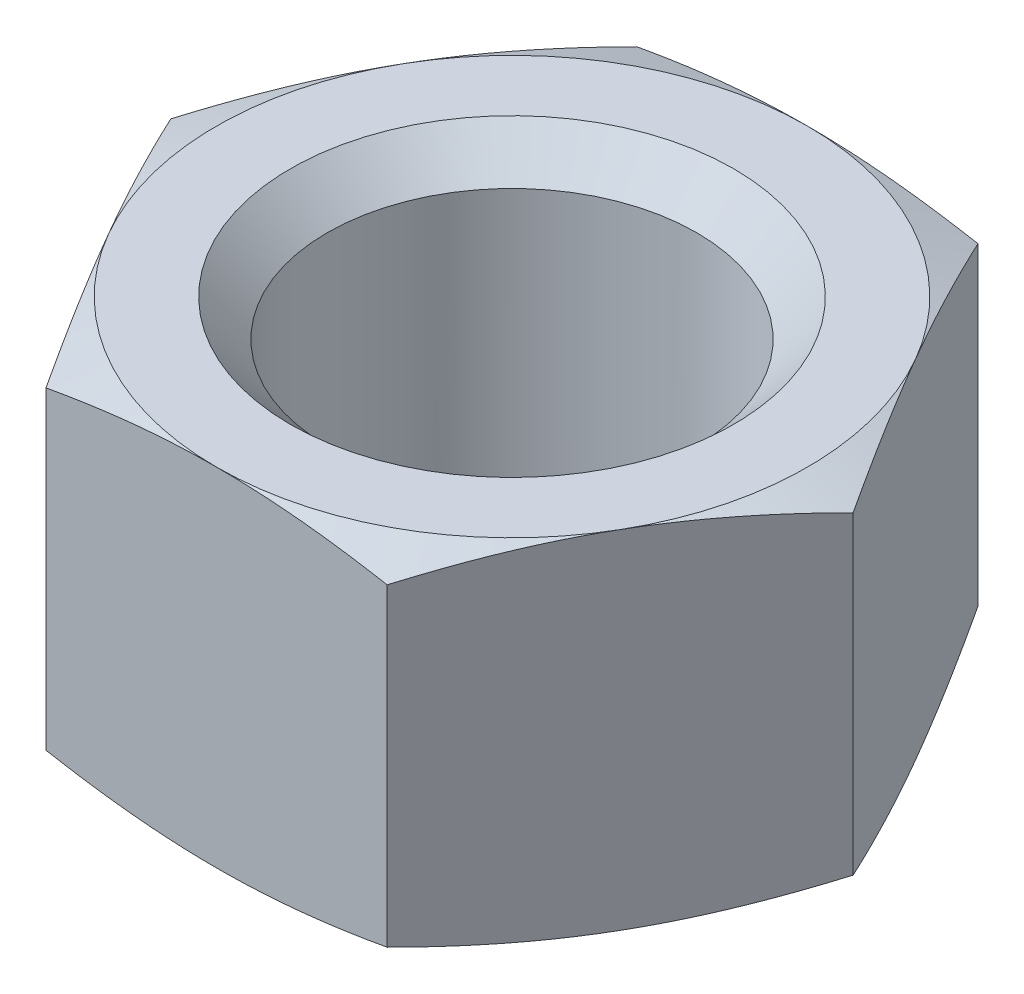
ISO-10303-21;
HEADER;
FILE_DESCRIPTION(('STEP AP214'),'2;1');
FILE_NAME('part.step','',(''),(''),'','','');
FILE_SCHEMA(('AUTOMOTIVE_DESIGN { 1 0 10303 214 1 1 1 1 }'));
ENDSEC;
DATA;
#1=APPLICATION_CONTEXT('core data for automotive mechanical design processes');
#2=APPLICATION_PROTOCOL_DEFINITION('international standard','automotive_design',2000,#1);
#3=PRODUCT_CONTEXT('',#1,'mechanical');
#4=PRODUCT('Part','Part','',(#3));
#5=PRODUCT_RELATED_PRODUCT_CATEGORY('part','',(#4));
#6=PRODUCT_DEFINITION_FORMATION('','',#4);
#7=PRODUCT_DEFINITION_CONTEXT('part definition',#1,'design');
#8=PRODUCT_DEFINITION('design','',#6,#7);
#9=PRODUCT_DEFINITION_SHAPE('','',#8);
#10=(LENGTH_UNIT() NAMED_UNIT(*) SI_UNIT(.MILLI.,.METRE.));
#11=(NAMED_UNIT(*) PLANE_ANGLE_UNIT() SI_UNIT($,.RADIAN.));
#12=(NAMED_UNIT(*) SI_UNIT($,.STERADIAN.) SOLID_ANGLE_UNIT());
#13=UNCERTAINTY_MEASURE_WITH_UNIT(LENGTH_MEASURE(1.E-05),#10,'distance_accuracy_value','');
#14=(GEOMETRIC_REPRESENTATION_CONTEXT(3) GLOBAL_UNCERTAINTY_ASSIGNED_CONTEXT((#13)) GLOBAL_UNIT_ASSIGNED_CONTEXT((#10,
#11,#12)) REPRESENTATION_CONTEXT('',''));
#15=CARTESIAN_POINT('',(0.,0.,0.));
#16=DIRECTION('',(0.,0.,1.));
#17=DIRECTION('',(1.,0.,0.));
#18=AXIS2_PLACEMENT_3D('',#15,#16,#17);
#19=CARTESIAN_POINT('',(2.309401076759,0.,4.));
#20=DIRECTION('',(0.866025403784429,0.,0.500000000000017));
#21=DIRECTION('',(0.,-1.,0.));
#22=AXIS2_PLACEMENT_3D('',#19,#20,#21);
#23=PLANE('',#22);
#24=CARTESIAN_POINT('',(3.46410161470624,1.14020946343584E-11,2.00000000074835));
#25=CARTESIAN_POINT('',(2.92820323145135,9.56413899898993E-11,2.9282032282398));
#26=CARTESIAN_POINT('',(2.30940108025935,0.225225563508639,3.99999999393722));
#27=(BOUNDED_CURVE() B_SPLINE_CURVE(2,(#24,#25,#26),.UNSPECIFIED.,.F.,
.F.) B_SPLINE_CURVE_WITH_KNOTS((3,3),(2.00756078282778,2.6687560447506),
.UNSPECIFIED.) CURVE() GEOMETRIC_REPRESENTATION_ITEM() RATIONAL_B_SPLINE_CURVE((2.95757766143731,
2.95757766135174,2.74523314025181)) REPRESENTATION_ITEM(''));
#28=CARTESIAN_POINT('',(3.46410161482126,4.44756943242701E-12,2.00000000051092));
#29=VERTEX_POINT('',#28);
#30=CARTESIAN_POINT('',(2.30940108000073,0.225225564373383,3.99999999797907));
#31=VERTEX_POINT('',#30);
#32=EDGE_CURVE('E234',#29,#31,#27,.T.);
#33=ORIENTED_EDGE('',*,*,#32,.F.);
#34=CARTESIAN_POINT('',(4.61880215662965,0.22522556591548,-5.39021444243167E-09));
#35=CARTESIAN_POINT('',(4.00000000101983,-7.28371252201043E-11,1.07179676795908));
#36=CARTESIAN_POINT('',(3.46410161470624,1.14020946343584E-11,2.00000000074835));
#37=(BOUNDED_CURVE() B_SPLINE_CURVE(2,(#34,#35,#36),.UNSPECIFIED.,.F.,
.F.) B_SPLINE_CURVE_WITH_KNOTS((3,3),(1.34636551709286,2.00756078282778),
.UNSPECIFIED.) CURVE() GEOMETRIC_REPRESENTATION_ITEM() RATIONAL_B_SPLINE_CURVE((2.74523313814554,
2.95757766152287,2.95757766143731)) REPRESENTATION_ITEM(''));
#38=CARTESIAN_POINT('',(4.61880215338791,0.225225564373411,-3.81742094532033E-09));
#39=VERTEX_POINT('',#38);
#40=EDGE_CURVE('E225',#39,#29,#37,.T.);
#41=ORIENTED_EDGE('',*,*,#40,.F.);
#42=DIRECTION('',(0.,-1.,0.));
#43=VECTOR('',#42,1.);
#44=CARTESIAN_POINT('',(4.61880215351704,0.,0.));
#45=LINE('',#44,#43);
#46=CARTESIAN_POINT('',(4.6188021533879,4.47477443561211,3.81835989915224E-09));
#47=VERTEX_POINT('',#46);
#48=EDGE_CURVE('E11',#47,#39,#45,.T.);
#49=ORIENTED_EDGE('',*,*,#48,.F.);
#50=CARTESIAN_POINT('',(3.46410161493593,4.69999999997409,2.00000000035052));
#51=CARTESIAN_POINT('',(3.99999999848508,4.70000000001353,1.07179677234939));
#52=CARTESIAN_POINT('',(4.61880215001685,4.47477443647687,6.06347965369875E-09));
#53=(BOUNDED_CURVE() B_SPLINE_CURVE(2,(#50,#51,#52),.UNSPECIFIED.,.F.,
.F.) B_SPLINE_CURVE_WITH_KNOTS((3,3),(2.0075607824375,2.66875604475169),
.UNSPECIFIED.) CURVE() GEOMETRIC_REPRESENTATION_ITEM() RATIONAL_B_SPLINE_CURVE((2.95757766143833,
2.95757766147838,2.74523314025277)) REPRESENTATION_ITEM(''));
#54=CARTESIAN_POINT('',(3.46410161497142,4.699999999988,2.00000000025083));
#55=VERTEX_POINT('',#54);
#56=EDGE_CURVE('E21',#55,#47,#53,.T.);
#57=ORIENTED_EDGE('',*,*,#56,.F.);
#58=CARTESIAN_POINT('',(2.30940107364668,4.47477443407004,4.00000000539069));
#59=CARTESIAN_POINT('',(2.92820322891665,4.69999999993465,2.92820323263003));
#60=CARTESIAN_POINT('',(3.46410161493593,4.69999999997409,2.00000000035052));
#61=(BOUNDED_CURVE() B_SPLINE_CURVE(2,(#58,#59,#60),.UNSPECIFIED.,.F.,
.F.) B_SPLINE_CURVE_WITH_KNOTS((3,3),(1.34636551709355,2.0075607824375),
.UNSPECIFIED.) CURVE() GEOMETRIC_REPRESENTATION_ITEM() RATIONAL_B_SPLINE_CURVE((2.74523313814651,
2.95757766139827,2.95757766143833)) REPRESENTATION_ITEM(''));
#62=CARTESIAN_POINT('',(2.30940107338807,4.4747744356121,4.0000000017969));
#63=VERTEX_POINT('',#62);
#64=EDGE_CURVE('E372',#63,#55,#61,.T.);
#65=ORIENTED_EDGE('',*,*,#64,.F.);
#66=DIRECTION('',(0.,1.,0.));
#67=VECTOR('',#66,1.);
#68=CARTESIAN_POINT('',(2.309401076759,0.,4.));
#69=LINE('',#68,#67);
#70=EDGE_CURVE('E385',#31,#63,#69,.T.);
#71=ORIENTED_EDGE('',*,*,#70,.F.);
#72=EDGE_LOOP('',(#33,#41,#49,#57,#65,#71));
#73=FACE_BOUND('',#72,.T.);
#74=ADVANCED_FACE('F17',(#73),#23,.T.);
#75=CARTESIAN_POINT('',(4.618802153517,0.,0.));
#76=DIRECTION('',(0.866025403784429,0.,-0.500000000000017));
#77=DIRECTION('',(0.,-1.,0.));
#78=AXIS2_PLACEMENT_3D('',#75,#76,#77);
#79=PLANE('',#78);
#80=CARTESIAN_POINT('',(3.46410161470579,1.12123012204531E-11,-2.00000000074809));
#81=CARTESIAN_POINT('',(3.99999999836179,-7.3027153963074E-11,-1.0717967725619));
#82=CARTESIAN_POINT('',(4.61880215001704,0.225225563508688,-6.06211368982928E-09));
#83=(BOUNDED_CURVE() B_SPLINE_CURVE(2,(#80,#81,#82),.UNSPECIFIED.,.F.,
.F.) B_SPLINE_CURVE_WITH_KNOTS((3,3),(2.00756078229499,2.66875604475104),
.UNSPECIFIED.) CURVE() GEOMETRIC_REPRESENTATION_ITEM() RATIONAL_B_SPLINE_CURVE((2.95757766143769,
2.95757766152326,2.74523314025193)) REPRESENTATION_ITEM(''));
#84=CARTESIAN_POINT('',(3.46410161482103,4.35192333854522E-12,-2.00000000051078));
#85=VERTEX_POINT('',#84);
#86=EDGE_CURVE('E224',#85,#39,#83,.T.);
#87=ORIENTED_EDGE('',*,*,#86,.F.);
#88=CARTESIAN_POINT('',(2.30940107364607,0.225225565915347,-4.00000000539071));
#89=CARTESIAN_POINT('',(2.92820322879305,9.54518131202065E-11,-2.92820323284306));
#90=CARTESIAN_POINT('',(3.46410161470579,1.12123012204531E-11,-2.00000000074809));
#91=(BOUNDED_CURVE() B_SPLINE_CURVE(2,(#88,#89,#90),.UNSPECIFIED.,.F.,
.F.) B_SPLINE_CURVE_WITH_KNOTS((3,3),(1.34636551709281,2.00756078229499),
.UNSPECIFIED.) CURVE() GEOMETRIC_REPRESENTATION_ITEM() RATIONAL_B_SPLINE_CURVE((2.74523313814582,
2.95757766135213,2.95757766143769)) REPRESENTATION_ITEM(''));
#92=CARTESIAN_POINT('',(2.30940107338765,0.225225564373285,-4.0000000017969));
#93=VERTEX_POINT('',#92);
#94=EDGE_CURVE('E218',#93,#85,#91,.T.);
#95=ORIENTED_EDGE('',*,*,#94,.F.);
#96=DIRECTION('',(0.,-1.,0.));
#97=VECTOR('',#96,1.);
#98=CARTESIAN_POINT('',(2.309401076759,0.,-4.));
#99=LINE('',#98,#97);
#100=CARTESIAN_POINT('',(2.30940108000036,4.47477443561222,-3.99999999797905));
#101=VERTEX_POINT('',#100);
#102=EDGE_CURVE('E30',#101,#93,#99,.T.);
#103=ORIENTED_EDGE('',*,*,#102,.F.);
#104=CARTESIAN_POINT('',(3.46410161493548,4.69999999997428,-2.00000000035026));
#105=CARTESIAN_POINT('',(2.92820323157395,4.69999999993484,-2.92820322802641));
#106=CARTESIAN_POINT('',(2.30940108025878,4.47477443647698,-3.99999999393715));
#107=(BOUNDED_CURVE() B_SPLINE_CURVE(2,(#104,#105,#106),.UNSPECIFIED.,.F.,
.F.) B_SPLINE_CURVE_WITH_KNOTS((3,3),(2.00756078268566,2.66875604475017),
.UNSPECIFIED.) CURVE() GEOMETRIC_REPRESENTATION_ITEM() RATIONAL_B_SPLINE_CURVE((2.95757766143711,
2.95757766139706,2.74523314025155)) REPRESENTATION_ITEM(''));
#108=CARTESIAN_POINT('',(3.46410161497119,4.699999999988,-2.0000000002507));
#109=VERTEX_POINT('',#108);
#110=EDGE_CURVE('E267',#109,#101,#107,.T.);
#111=ORIENTED_EDGE('',*,*,#110,.F.);
#112=CARTESIAN_POINT('',(4.6188021566298,4.47477443406995,5.39153414083028E-09));
#113=CARTESIAN_POINT('',(4.0000000011427,4.70000000001372,-1.07179676774521));
#114=CARTESIAN_POINT('',(3.46410161493548,4.69999999997428,-2.00000000035026));
#115=(BOUNDED_CURVE() B_SPLINE_CURVE(2,(#112,#113,#114),.UNSPECIFIED.,.F.,
.F.) B_SPLINE_CURVE_WITH_KNOTS((3,3),(1.34636551709218,2.00756078268566),
.UNSPECIFIED.) CURVE() GEOMETRIC_REPRESENTATION_ITEM() RATIONAL_B_SPLINE_CURVE((2.74523313814512,
2.95757766147717,2.95757766143711)) REPRESENTATION_ITEM(''));
#116=EDGE_CURVE('E337',#47,#109,#115,.T.);
#117=ORIENTED_EDGE('',*,*,#116,.F.);
#118=ORIENTED_EDGE('',*,*,#48,.T.);
#119=EDGE_LOOP('',(#87,#95,#103,#111,#117,#118));
#120=FACE_BOUND('',#119,.T.);
#121=ADVANCED_FACE('F471',(#120),#79,.T.);
#122=CARTESIAN_POINT('',(2.309401076759,0.,-4.));
#123=DIRECTION('',(0.,0.,-1.));
#124=DIRECTION('',(0.,-1.,0.));
#125=AXIS2_PLACEMENT_3D('',#122,#123,#124);
#126=PLANE('',#125);
#127=CARTESIAN_POINT('',(0.,1.12299441660873E-11,-4.));
#128=CARTESIAN_POINT('',(1.07179676691078,1.12305166087593E-11,-4.));
#129=CARTESIAN_POINT('',(2.30940106975789,0.225225563508565,-4.));
#130=(BOUNDED_CURVE() B_SPLINE_CURVE(2,(#127,#128,#129),.UNSPECIFIED.,.F.,
.F.) B_SPLINE_CURVE_WITH_KNOTS((3,3),(2.00756078255173,2.6687560447386),
.UNSPECIFIED.) CURVE() GEOMETRIC_REPRESENTATION_ITEM() RATIONAL_B_SPLINE_CURVE((2.95757766142647,
2.95757766142647,2.74523314024164)) REPRESENTATION_ITEM(''));
#131=CARTESIAN_POINT('',(0.,4.36107783491888E-12,-3.99999999998113));
#132=VERTEX_POINT('',#131);
#133=EDGE_CURVE('E210',#132,#93,#130,.T.);
#134=ORIENTED_EDGE('',*,*,#133,.F.);
#135=CARTESIAN_POINT('',(-2.30940108298363,0.225225565915451,-4.));
#136=CARTESIAN_POINT('',(-1.07179677222651,1.12293230269955E-11,-4.));
#137=CARTESIAN_POINT('',(0.,1.12299441660873E-11,-4.));
#138=(BOUNDED_CURVE() B_SPLINE_CURVE(2,(#135,#136,#137),.UNSPECIFIED.,.F.,
.F.) B_SPLINE_CURVE_WITH_KNOTS((3,3),(1.34636551708556,2.00756078255173),
.UNSPECIFIED.) CURVE() GEOMETRIC_REPRESENTATION_ITEM() RATIONAL_B_SPLINE_CURVE((2.74523313813533,
2.95757766142647,2.95757766142647)) REPRESENTATION_ITEM(''));
#139=CARTESIAN_POINT('',(-2.30940108000062,0.225225564373398,-3.99999999797914));
#140=VERTEX_POINT('',#139);
#141=EDGE_CURVE('E200',#140,#132,#138,.T.);
#142=ORIENTED_EDGE('',*,*,#141,.F.);
#143=DIRECTION('',(0.,-1.,0.));
#144=VECTOR('',#143,1.);
#145=CARTESIAN_POINT('',(-2.309401076759,0.,-4.));
#146=LINE('',#145,#144);
#147=CARTESIAN_POINT('',(-2.30940107338807,4.4747744356121,-4.0000000017969));
#148=VERTEX_POINT('',#147);
#149=EDGE_CURVE('E381',#148,#140,#146,.T.);
#150=ORIENTED_EDGE('',*,*,#149,.F.);
#151=CARTESIAN_POINT('',(0.,4.69999999997426,-4.));
#152=CARTESIAN_POINT('',(-1.07179676691104,4.69999999997426,-4.));
#153=CARTESIAN_POINT('',(-2.30940106975854,4.47477443647681,-4.));
#154=(BOUNDED_CURVE() B_SPLINE_CURVE(2,(#151,#152,#153),.UNSPECIFIED.,.F.,
.F.) B_SPLINE_CURVE_WITH_KNOTS((3,3),(2.00756078255172,2.66875604473876),
.UNSPECIFIED.) CURVE() GEOMETRIC_REPRESENTATION_ITEM() RATIONAL_B_SPLINE_CURVE((2.95757766142647,
2.95757766142647,2.74523314024154)) REPRESENTATION_ITEM(''));
#155=CARTESIAN_POINT('',(0.,4.69999999998113,-3.99999999998113));
#156=VERTEX_POINT('',#155);
#157=EDGE_CURVE('E189',#156,#148,#154,.T.);
#158=ORIENTED_EDGE('',*,*,#157,.F.);
#159=CARTESIAN_POINT('',(2.3094010829833,4.4747744340701,-4.));
#160=CARTESIAN_POINT('',(1.07179677222639,4.69999999997426,-4.));
#161=CARTESIAN_POINT('',(0.,4.69999999997426,-4.));
#162=(BOUNDED_CURVE() B_SPLINE_CURVE(2,(#159,#160,#161),.UNSPECIFIED.,.F.,
.F.) B_SPLINE_CURVE_WITH_KNOTS((3,3),(1.34636551708564,2.00756078255172),
.UNSPECIFIED.) CURVE() GEOMETRIC_REPRESENTATION_ITEM() RATIONAL_B_SPLINE_CURVE((2.74523313813538,
2.95757766142647,2.95757766142647)) REPRESENTATION_ITEM(''));
#163=EDGE_CURVE('E400',#101,#156,#162,.T.);
#164=ORIENTED_EDGE('',*,*,#163,.F.);
#165=ORIENTED_EDGE('',*,*,#102,.T.);
#166=EDGE_LOOP('',(#134,#142,#150,#158,#164,#165));
#167=FACE_BOUND('',#166,.T.);
#168=ADVANCED_FACE('F476',(#167),#126,.T.);
#169=CARTESIAN_POINT('',(-2.309401076759,0.,-4.));
#170=DIRECTION('',(-0.866025403784429,0.,-0.500000000000017));
#171=DIRECTION('',(-0.500000000000017,0.,0.866025403784429));
#172=AXIS2_PLACEMENT_3D('',#169,#170,#171);
#173=PLANE('',#172);
#174=CARTESIAN_POINT('',(-3.46410161470624,1.14023198638846E-11,-2.00000000074835));
#175=CARTESIAN_POINT('',(-2.9282032314513,9.56419066942981E-11,-2.92820322823989));
#176=CARTESIAN_POINT('',(-2.30940108025923,0.225225563508684,-3.99999999393743));
#177=(BOUNDED_CURVE() B_SPLINE_CURVE(2,(#174,#175,#176),.UNSPECIFIED.,.F.,
.F.) B_SPLINE_CURVE_WITH_KNOTS((3,3),(2.00756078282778,2.66875604475066),
.UNSPECIFIED.) CURVE() GEOMETRIC_REPRESENTATION_ITEM() RATIONAL_B_SPLINE_CURVE((2.9575776614373,
2.95757766135174,2.74523314025177)) REPRESENTATION_ITEM(''));
#178=CARTESIAN_POINT('',(-3.46410161482126,4.44757117612374E-12,-2.00000000051091));
#179=VERTEX_POINT('',#178);
#180=EDGE_CURVE('E191',#179,#140,#177,.T.);
#181=ORIENTED_EDGE('',*,*,#180,.F.);
#182=CARTESIAN_POINT('',(-4.61880215662966,0.225225565915486,5.39024226642339E-09));
#183=CARTESIAN_POINT('',(-4.00000000101984,-7.28371807312556E-11,-1.07179676795907));
#184=CARTESIAN_POINT('',(-3.46410161470624,1.14023198638846E-11,-2.00000000074835));
#185=(BOUNDED_CURVE() B_SPLINE_CURVE(2,(#182,#183,#184),.UNSPECIFIED.,.F.,
.F.) B_SPLINE_CURVE_WITH_KNOTS((3,3),(1.34636551709285,2.00756078282778),
.UNSPECIFIED.) CURVE() GEOMETRIC_REPRESENTATION_ITEM() RATIONAL_B_SPLINE_CURVE((2.74523313814553,
2.95757766152287,2.9575776614373)) REPRESENTATION_ITEM(''));
#186=CARTESIAN_POINT('',(-4.61880215338791,0.22522556437341,3.81743836736572E-09));
#187=VERTEX_POINT('',#186);
#188=EDGE_CURVE('E201',#187,#179,#185,.T.);
#189=ORIENTED_EDGE('',*,*,#188,.F.);
#190=DIRECTION('',(0.,-1.,0.));
#191=VECTOR('',#190,1.);
#192=CARTESIAN_POINT('',(-4.61880215351704,0.,0.));
#193=LINE('',#192,#191);
#194=CARTESIAN_POINT('',(-4.61880215338791,4.47477443561209,-3.81817221692506E-09));
#195=VERTEX_POINT('',#194);
#196=EDGE_CURVE('E382',#195,#187,#193,.T.);
#197=ORIENTED_EDGE('',*,*,#196,.F.);
#198=CARTESIAN_POINT('',(-3.46410161493593,4.69999999997409,-2.00000000035052));
#199=CARTESIAN_POINT('',(-3.99999999848515,4.70000000001353,-1.07179677234927));
#200=CARTESIAN_POINT('',(-4.61880215001703,4.47477443647681,-6.06317650160331E-09));
#201=(BOUNDED_CURVE() B_SPLINE_CURVE(2,(#198,#199,#200),.UNSPECIFIED.,.F.,
.F.) B_SPLINE_CURVE_WITH_KNOTS((3,3),(2.0075607824375,2.66875604475178),
.UNSPECIFIED.) CURVE() GEOMETRIC_REPRESENTATION_ITEM() RATIONAL_B_SPLINE_CURVE((2.95757766143833,
2.95757766147839,2.74523314025272)) REPRESENTATION_ITEM(''));
#202=CARTESIAN_POINT('',(-3.46410161497142,4.699999999988,-2.00000000025083));
#203=VERTEX_POINT('',#202);
#204=EDGE_CURVE('E190',#203,#195,#201,.T.);
#205=ORIENTED_EDGE('',*,*,#204,.F.);
#206=CARTESIAN_POINT('',(-2.30940107364668,4.47477443407004,-4.00000000539069));
#207=CARTESIAN_POINT('',(-2.92820322891665,4.69999999993465,-2.92820323263003));
#208=CARTESIAN_POINT('',(-3.46410161493593,4.69999999997409,-2.00000000035052));
#209=(BOUNDED_CURVE() B_SPLINE_CURVE(2,(#206,#207,#208),.UNSPECIFIED.,.F.,
.F.) B_SPLINE_CURVE_WITH_KNOTS((3,3),(1.34636551709355,2.0075607824375),
.UNSPECIFIED.) CURVE() GEOMETRIC_REPRESENTATION_ITEM() RATIONAL_B_SPLINE_CURVE((2.74523313814651,
2.95757766139827,2.95757766143833)) REPRESENTATION_ITEM(''));
#210=EDGE_CURVE('E263',#148,#203,#209,.T.);
#211=ORIENTED_EDGE('',*,*,#210,.F.);
#212=ORIENTED_EDGE('',*,*,#149,.T.);
#213=EDGE_LOOP('',(#181,#189,#197,#205,#211,#212));
#214=FACE_BOUND('',#213,.T.);
#215=ADVANCED_FACE('F445',(#214),#173,.T.);
#216=CARTESIAN_POINT('',(-4.618802153517,0.,0.));
#217=DIRECTION('',(-0.866025403784429,0.,0.500000000000017));
#218=DIRECTION('',(0.,1.,0.));
#219=AXIS2_PLACEMENT_3D('',#216,#217,#218);
#220=PLANE('',#219);
#221=CARTESIAN_POINT('',(-3.46410161493548,1.12123011939482E-11,2.00000000035025));
#222=CARTESIAN_POINT('',(-3.99999999848487,-2.82250090537475E-11,1.07179677234871));
#223=CARTESIAN_POINT('',(-4.61880215001702,0.225225563508682,6.06213827847308E-09));
#224=(BOUNDED_CURVE() B_SPLINE_CURVE(2,(#221,#222,#223),.UNSPECIFIED.,.F.,
.F.) B_SPLINE_CURVE_WITH_KNOTS((3,3),(2.00756078243669,2.66875604475103),
.UNSPECIFIED.) CURVE() GEOMETRIC_REPRESENTATION_ITEM() RATIONAL_B_SPLINE_CURVE((2.95757766143769,
2.95757766147775,2.74523314025194)) REPRESENTATION_ITEM(''));
#225=CARTESIAN_POINT('',(-3.46410161497119,-2.50778673001328E-12,2.0000000002507));
#226=VERTEX_POINT('',#225);
#227=EDGE_CURVE('E366',#226,#187,#224,.T.);
#228=ORIENTED_EDGE('',*,*,#227,.F.);
#229=CARTESIAN_POINT('',(-2.30940107364606,0.225225565915348,4.00000000539071));
#230=CARTESIAN_POINT('',(-2.92820322891614,5.06497621621804E-11,2.92820323262986));
#231=CARTESIAN_POINT('',(-3.46410161493548,1.12123011939482E-11,2.00000000035025));
#232=(BOUNDED_CURVE() B_SPLINE_CURVE(2,(#229,#230,#231),.UNSPECIFIED.,.F.,
.F.) B_SPLINE_CURVE_WITH_KNOTS((3,3),(1.34636551709281,2.00756078243669),
.UNSPECIFIED.) CURVE() GEOMETRIC_REPRESENTATION_ITEM() RATIONAL_B_SPLINE_CURVE((2.74523313814582,
2.95757766139763,2.95757766143769)) REPRESENTATION_ITEM(''));
#233=CARTESIAN_POINT('',(-2.30940107338765,0.225225564373285,4.0000000017969));
#234=VERTEX_POINT('',#233);
#235=EDGE_CURVE('E326',#234,#226,#232,.T.);
#236=ORIENTED_EDGE('',*,*,#235,.F.);
#237=DIRECTION('',(0.,-1.,0.));
#238=VECTOR('',#237,1.);
#239=CARTESIAN_POINT('',(-2.309401076759,0.,4.));
#240=LINE('',#239,#238);
#241=CARTESIAN_POINT('',(-2.30940108000025,4.47477443561221,3.99999999797912));
#242=VERTEX_POINT('',#241);
#243=EDGE_CURVE('E44',#242,#234,#240,.T.);
#244=ORIENTED_EDGE('',*,*,#243,.F.);
#245=CARTESIAN_POINT('',(-3.46410161493548,4.69999999997428,2.00000000035026));
#246=CARTESIAN_POINT('',(-2.9282032315739,4.69999999993484,2.92820322802649));
#247=CARTESIAN_POINT('',(-2.30940108025866,4.47477443647694,3.99999999393735));
#248=(BOUNDED_CURVE() B_SPLINE_CURVE(2,(#245,#246,#247),.UNSPECIFIED.,.F.,
.F.) B_SPLINE_CURVE_WITH_KNOTS((3,3),(2.00756078268566,2.66875604475023),
.UNSPECIFIED.) CURVE() GEOMETRIC_REPRESENTATION_ITEM() RATIONAL_B_SPLINE_CURVE((2.95757766143711,
2.95757766139706,2.74523314025151)) REPRESENTATION_ITEM(''));
#249=CARTESIAN_POINT('',(-3.46410161497119,4.699999999988,2.0000000002507));
#250=VERTEX_POINT('',#249);
#251=EDGE_CURVE('E330',#250,#242,#248,.T.);
#252=ORIENTED_EDGE('',*,*,#251,.F.);
#253=CARTESIAN_POINT('',(-4.61880215662965,4.47477443407001,-5.39127401886112E-09));
#254=CARTESIAN_POINT('',(-4.00000000114264,4.70000000001372,1.07179676774532));
#255=CARTESIAN_POINT('',(-3.46410161493548,4.69999999997428,2.00000000035026));
#256=(BOUNDED_CURVE() B_SPLINE_CURVE(2,(#253,#254,#255),.UNSPECIFIED.,.F.,
.F.) B_SPLINE_CURVE_WITH_KNOTS((3,3),(1.34636551709226,2.00756078268566),
.UNSPECIFIED.) CURVE() GEOMETRIC_REPRESENTATION_ITEM() RATIONAL_B_SPLINE_CURVE((2.74523313814517,
2.95757766147717,2.95757766143711)) REPRESENTATION_ITEM(''));
#257=EDGE_CURVE('E135',#195,#250,#256,.T.);
#258=ORIENTED_EDGE('',*,*,#257,.F.);
#259=ORIENTED_EDGE('',*,*,#196,.T.);
#260=EDGE_LOOP('',(#228,#236,#244,#252,#258,#259));
#261=FACE_BOUND('',#260,.T.);
#262=ADVANCED_FACE('F450',(#261),#220,.T.);
#263=CARTESIAN_POINT('',(-2.309401076759,0.,4.));
#264=DIRECTION('',(0.,0.,1.));
#265=DIRECTION('',(1.,0.,0.));
#266=AXIS2_PLACEMENT_3D('',#263,#264,#265);
#267=PLANE('',#266);
#268=ORIENTED_EDGE('',*,*,#243,.T.);
#269=CARTESIAN_POINT('',(0.,1.12299441660873E-11,4.));
#270=CARTESIAN_POINT('',(-1.07179676691078,1.12299315611052E-11,4.));
#271=CARTESIAN_POINT('',(-2.30940106975789,0.225225563508564,4.));
#272=(BOUNDED_CURVE() B_SPLINE_CURVE(2,(#269,#270,#271),.UNSPECIFIED.,.F.,
.F.) B_SPLINE_CURVE_WITH_KNOTS((3,3),(2.00756078255173,2.6687560447386),
.UNSPECIFIED.) CURVE() GEOMETRIC_REPRESENTATION_ITEM() RATIONAL_B_SPLINE_CURVE((2.95757766142647,
2.95757766142647,2.74523314024164)) REPRESENTATION_ITEM(''));
#273=CARTESIAN_POINT('',(0.,4.36107783161015E-12,3.99999999998113));
#274=VERTEX_POINT('',#273);
#275=EDGE_CURVE('E354',#274,#234,#272,.T.);
#276=ORIENTED_EDGE('',*,*,#275,.F.);
#277=CARTESIAN_POINT('',(2.30940108298384,0.225225565915491,4.));
#278=CARTESIAN_POINT('',(1.0717967722266,1.12299891608103E-11,4.));
#279=CARTESIAN_POINT('',(0.,1.12299441660873E-11,4.));
#280=(BOUNDED_CURVE() B_SPLINE_CURVE(2,(#277,#278,#279),.UNSPECIFIED.,.F.,
.F.) B_SPLINE_CURVE_WITH_KNOTS((3,3),(1.3463655170855,2.00756078255173),
.UNSPECIFIED.) CURVE() GEOMETRIC_REPRESENTATION_ITEM() RATIONAL_B_SPLINE_CURVE((2.7452331381353,
2.95757766142647,2.95757766142647)) REPRESENTATION_ITEM(''));
#281=EDGE_CURVE('E346',#31,#274,#280,.T.);
#282=ORIENTED_EDGE('',*,*,#281,.F.);
#283=ORIENTED_EDGE('',*,*,#70,.T.);
#284=CARTESIAN_POINT('',(0.,4.69999999997426,4.));
#285=CARTESIAN_POINT('',(1.07179676691103,4.69999999997426,4.));
#286=CARTESIAN_POINT('',(2.30940106975853,4.47477443647681,4.));
#287=(BOUNDED_CURVE() B_SPLINE_CURVE(2,(#284,#285,#286),.UNSPECIFIED.,.F.,
.F.) B_SPLINE_CURVE_WITH_KNOTS((3,3),(2.00756078255172,2.66875604473876),
.UNSPECIFIED.) CURVE() GEOMETRIC_REPRESENTATION_ITEM() RATIONAL_B_SPLINE_CURVE((2.95757766142647,
2.95757766142647,2.74523314024154)) REPRESENTATION_ITEM(''));
#288=CARTESIAN_POINT('',(0.,4.69999999998113,3.99999999998113));
#289=VERTEX_POINT('',#288);
#290=EDGE_CURVE('E120',#289,#63,#287,.T.);
#291=ORIENTED_EDGE('',*,*,#290,.F.);
#292=CARTESIAN_POINT('',(-2.3094010829831,4.47477443407014,4.));
#293=CARTESIAN_POINT('',(-1.07179677222631,4.69999999997426,4.));
#294=CARTESIAN_POINT('',(0.,4.69999999997426,4.));
#295=(BOUNDED_CURVE() B_SPLINE_CURVE(2,(#292,#293,#294),.UNSPECIFIED.,.F.,
.F.) B_SPLINE_CURVE_WITH_KNOTS((3,3),(1.34636551708569,2.00756078255172),
.UNSPECIFIED.) CURVE() GEOMETRIC_REPRESENTATION_ITEM() RATIONAL_B_SPLINE_CURVE((2.74523313813542,
2.95757766142647,2.95757766142647)) REPRESENTATION_ITEM(''));
#296=EDGE_CURVE('E336',#242,#289,#295,.T.);
#297=ORIENTED_EDGE('',*,*,#296,.F.);
#298=EDGE_LOOP('',(#268,#276,#282,#283,#291,#297));
#299=FACE_BOUND('',#298,.T.);
#300=ADVANCED_FACE('F486',(#299),#267,.T.);
#301=CARTESIAN_POINT('',(0.,0.226576918095134,0.));
#302=DIRECTION('',(0.,1.,0.));
#303=DIRECTION('',(0.,0.,1.));
#304=AXIS2_PLACEMENT_3D('',#301,#302,#303);
#305=CONICAL_SURFACE('',#304,4.62251496622912,1.22173047640841);
#306=ORIENTED_EDGE('',*,*,#275,.T.);
#307=ORIENTED_EDGE('',*,*,#235,.T.);
#308=CARTESIAN_POINT('',(0.,-2.50778673001328E-12,0.));
#309=DIRECTION('',(0.,1.,0.));
#310=DIRECTION('',(0.,0.,1.));
#311=AXIS2_PLACEMENT_3D('',#308,#309,#310);
#312=CIRCLE('',#311,3.99999999996226);
#313=EDGE_CURVE('E312',#226,#274,#312,.T.);
#314=ORIENTED_EDGE('',*,*,#313,.T.);
#315=EDGE_LOOP('',(#306,#307,#314));
#316=FACE_BOUND('',#315,.T.);
#317=ADVANCED_FACE('F19',(#316),#305,.T.);
#318=CARTESIAN_POINT('',(0.,0.226576918095134,0.));
#319=DIRECTION('',(0.,1.,0.));
#320=DIRECTION('',(0.,0.,1.));
#321=AXIS2_PLACEMENT_3D('',#318,#319,#320);
#322=CONICAL_SURFACE('',#321,4.62251496622912,1.22173047640841);
#323=ORIENTED_EDGE('',*,*,#32,.T.);
#324=ORIENTED_EDGE('',*,*,#281,.T.);
#325=CARTESIAN_POINT('',(0.,-2.50778673001328E-12,0.));
#326=DIRECTION('',(0.,1.,0.));
#327=DIRECTION('',(0.,0.,1.));
#328=AXIS2_PLACEMENT_3D('',#325,#326,#327);
#329=CIRCLE('',#328,3.99999999996226);
#330=EDGE_CURVE('E304',#274,#29,#329,.T.);
#331=ORIENTED_EDGE('',*,*,#330,.T.);
#332=EDGE_LOOP('',(#323,#324,#331));
#333=FACE_BOUND('',#332,.T.);
#334=ADVANCED_FACE('F489',(#333),#322,.T.);
#335=CARTESIAN_POINT('',(0.,0.226576918095134,0.));
#336=DIRECTION('',(0.,1.,0.));
#337=DIRECTION('',(0.,0.,1.));
#338=AXIS2_PLACEMENT_3D('',#335,#336,#337);
#339=CONICAL_SURFACE('',#338,4.62251496622912,1.22173047640841);
#340=ORIENTED_EDGE('',*,*,#86,.T.);
#341=ORIENTED_EDGE('',*,*,#40,.T.);
#342=CARTESIAN_POINT('',(0.,-2.50778673001328E-12,0.));
#343=DIRECTION('',(0.,1.,0.));
#344=DIRECTION('',(0.,0.,1.));
#345=AXIS2_PLACEMENT_3D('',#342,#343,#344);
#346=CIRCLE('',#345,3.99999999996226);
#347=EDGE_CURVE('E282',#29,#85,#346,.T.);
#348=ORIENTED_EDGE('',*,*,#347,.T.);
#349=EDGE_LOOP('',(#340,#341,#348));
#350=FACE_BOUND('',#349,.T.);
#351=ADVANCED_FACE('F492',(#350),#339,.T.);
#352=CARTESIAN_POINT('',(0.,0.226576918095134,0.));
#353=DIRECTION('',(0.,1.,0.));
#354=DIRECTION('',(0.,0.,1.));
#355=AXIS2_PLACEMENT_3D('',#352,#353,#354);
#356=CONICAL_SURFACE('',#355,4.62251496622912,1.22173047640841);
#357=ORIENTED_EDGE('',*,*,#133,.T.);
#358=ORIENTED_EDGE('',*,*,#94,.T.);
#359=CARTESIAN_POINT('',(0.,-2.50778673001328E-12,0.));
#360=DIRECTION('',(0.,1.,0.));
#361=DIRECTION('',(0.,0.,1.));
#362=AXIS2_PLACEMENT_3D('',#359,#360,#361);
#363=CIRCLE('',#362,3.99999999996226);
#364=EDGE_CURVE('E274',#85,#132,#363,.T.);
#365=ORIENTED_EDGE('',*,*,#364,.T.);
#366=EDGE_LOOP('',(#357,#358,#365));
#367=FACE_BOUND('',#366,.T.);
#368=ADVANCED_FACE('F493',(#367),#356,.T.);
#369=CARTESIAN_POINT('',(0.,0.226576918095134,0.));
#370=DIRECTION('',(0.,1.,0.));
#371=DIRECTION('',(0.,0.,1.));
#372=AXIS2_PLACEMENT_3D('',#369,#370,#371);
#373=CONICAL_SURFACE('',#372,4.62251496622912,1.22173047640841);
#374=ORIENTED_EDGE('',*,*,#180,.T.);
#375=ORIENTED_EDGE('',*,*,#141,.T.);
#376=CARTESIAN_POINT('',(0.,-2.50778673001328E-12,0.));
#377=DIRECTION('',(0.,1.,0.));
#378=DIRECTION('',(0.,0.,1.));
#379=AXIS2_PLACEMENT_3D('',#376,#377,#378);
#380=CIRCLE('',#379,3.99999999996226);
#381=EDGE_CURVE('E268',#132,#179,#380,.T.);
#382=ORIENTED_EDGE('',*,*,#381,.T.);
#383=EDGE_LOOP('',(#374,#375,#382));
#384=FACE_BOUND('',#383,.T.);
#385=ADVANCED_FACE('F496',(#384),#373,.T.);
#386=CARTESIAN_POINT('',(0.,0.226576918095134,0.));
#387=DIRECTION('',(0.,1.,0.));
#388=DIRECTION('',(0.,0.,1.));
#389=AXIS2_PLACEMENT_3D('',#386,#387,#388);
#390=CONICAL_SURFACE('',#389,4.62251496622912,1.22173047640841);
#391=ORIENTED_EDGE('',*,*,#227,.T.);
#392=ORIENTED_EDGE('',*,*,#188,.T.);
#393=CARTESIAN_POINT('',(0.,-2.50778673001328E-12,0.));
#394=DIRECTION('',(0.,1.,0.));
#395=DIRECTION('',(0.,0.,1.));
#396=AXIS2_PLACEMENT_3D('',#393,#394,#395);
#397=CIRCLE('',#396,3.99999999996226);
#398=EDGE_CURVE('E322',#179,#226,#397,.T.);
#399=ORIENTED_EDGE('',*,*,#398,.T.);
#400=EDGE_LOOP('',(#391,#392,#399));
#401=FACE_BOUND('',#400,.T.);
#402=ADVANCED_FACE('F508',(#401),#390,.T.);
#403=CARTESIAN_POINT('',(0.,4.47342308189036,0.));
#404=DIRECTION('',(0.,-1.,0.));
#405=DIRECTION('',(0.,0.,-1.));
#406=AXIS2_PLACEMENT_3D('',#403,#404,#405);
#407=CONICAL_SURFACE('',#406,4.62251496622912,1.22173047640841);
#408=ORIENTED_EDGE('',*,*,#290,.T.);
#409=ORIENTED_EDGE('',*,*,#64,.T.);
#410=CARTESIAN_POINT('',(0.,4.699999999988,0.));
#411=DIRECTION('',(0.,1.,0.));
#412=DIRECTION('',(0.,0.,-1.));
#413=AXIS2_PLACEMENT_3D('',#410,#411,#412);
#414=CIRCLE('',#413,3.99999999996226);
#415=EDGE_CURVE('E262',#289,#55,#414,.T.);
#416=ORIENTED_EDGE('',*,*,#415,.F.);
#417=EDGE_LOOP('',(#408,#409,#416));
#418=FACE_BOUND('',#417,.T.);
#419=ADVANCED_FACE('F505',(#418),#407,.T.);
#420=CARTESIAN_POINT('',(0.,4.47342308189036,0.));
#421=DIRECTION('',(0.,-1.,0.));
#422=DIRECTION('',(0.,0.,-1.));
#423=AXIS2_PLACEMENT_3D('',#420,#421,#422);
#424=CONICAL_SURFACE('',#423,4.62251496622912,1.22173047640841);
#425=ORIENTED_EDGE('',*,*,#56,.T.);
#426=ORIENTED_EDGE('',*,*,#116,.T.);
#427=CARTESIAN_POINT('',(0.,4.699999999988,0.));
#428=DIRECTION('',(0.,1.,0.));
#429=DIRECTION('',(0.,0.,-1.));
#430=AXIS2_PLACEMENT_3D('',#427,#428,#429);
#431=CIRCLE('',#430,3.99999999996226);
#432=EDGE_CURVE('E243',#55,#109,#431,.T.);
#433=ORIENTED_EDGE('',*,*,#432,.F.);
#434=EDGE_LOOP('',(#425,#426,#433));
#435=FACE_BOUND('',#434,.T.);
#436=ADVANCED_FACE('F484',(#435),#424,.T.);
#437=CARTESIAN_POINT('',(0.,4.47342308189036,0.));
#438=DIRECTION('',(0.,-1.,0.));
#439=DIRECTION('',(0.,0.,-1.));
#440=AXIS2_PLACEMENT_3D('',#437,#438,#439);
#441=CONICAL_SURFACE('',#440,4.62251496622912,1.22173047640841);
#442=ORIENTED_EDGE('',*,*,#110,.T.);
#443=ORIENTED_EDGE('',*,*,#163,.T.);
#444=CARTESIAN_POINT('',(0.,4.699999999988,0.));
#445=DIRECTION('',(0.,1.,0.));
#446=DIRECTION('',(0.,0.,-1.));
#447=AXIS2_PLACEMENT_3D('',#444,#445,#446);
#448=CIRCLE('',#447,3.99999999996226);
#449=EDGE_CURVE('E235',#109,#156,#448,.T.);
#450=ORIENTED_EDGE('',*,*,#449,.F.);
#451=EDGE_LOOP('',(#442,#443,#450));
#452=FACE_BOUND('',#451,.T.);
#453=ADVANCED_FACE('F480',(#452),#441,.T.);
#454=CARTESIAN_POINT('',(0.,4.47342308189036,0.));
#455=DIRECTION('',(0.,-1.,0.));
#456=DIRECTION('',(0.,0.,-1.));
#457=AXIS2_PLACEMENT_3D('',#454,#455,#456);
#458=CONICAL_SURFACE('',#457,4.62251496622912,1.22173047640841);
#459=ORIENTED_EDGE('',*,*,#157,.T.);
#460=ORIENTED_EDGE('',*,*,#210,.T.);
#461=CARTESIAN_POINT('',(0.,4.699999999988,0.));
#462=DIRECTION('',(0.,1.,0.));
#463=DIRECTION('',(0.,0.,-1.));
#464=AXIS2_PLACEMENT_3D('',#461,#462,#463);
#465=CIRCLE('',#464,3.99999999996226);
#466=EDGE_CURVE('E242',#156,#203,#465,.T.);
#467=ORIENTED_EDGE('',*,*,#466,.F.);
#468=EDGE_LOOP('',(#459,#460,#467));
#469=FACE_BOUND('',#468,.T.);
#470=ADVANCED_FACE('F483',(#469),#458,.T.);
#471=CARTESIAN_POINT('',(0.,4.47342308189036,0.));
#472=DIRECTION('',(0.,-1.,0.));
#473=DIRECTION('',(0.,0.,-1.));
#474=AXIS2_PLACEMENT_3D('',#471,#472,#473);
#475=CONICAL_SURFACE('',#474,4.62251496622912,1.22173047640841);
#476=ORIENTED_EDGE('',*,*,#204,.T.);
#477=ORIENTED_EDGE('',*,*,#257,.T.);
#478=CARTESIAN_POINT('',(0.,4.699999999988,0.));
#479=DIRECTION('',(0.,1.,0.));
#480=DIRECTION('',(0.,0.,-1.));
#481=AXIS2_PLACEMENT_3D('',#478,#479,#480);
#482=CIRCLE('',#481,3.99999999996226);
#483=EDGE_CURVE('E249',#203,#250,#482,.T.);
#484=ORIENTED_EDGE('',*,*,#483,.F.);
#485=EDGE_LOOP('',(#476,#477,#484));
#486=FACE_BOUND('',#485,.T.);
#487=ADVANCED_FACE('F442',(#486),#475,.T.);
#488=CARTESIAN_POINT('',(0.,4.47342308189036,0.));
#489=DIRECTION('',(0.,-1.,0.));
#490=DIRECTION('',(0.,0.,-1.));
#491=AXIS2_PLACEMENT_3D('',#488,#489,#490);
#492=CONICAL_SURFACE('',#491,4.62251496622912,1.22173047640841);
#493=ORIENTED_EDGE('',*,*,#251,.T.);
#494=ORIENTED_EDGE('',*,*,#296,.T.);
#495=CARTESIAN_POINT('',(0.,4.699999999988,0.));
#496=DIRECTION('',(0.,1.,0.));
#497=DIRECTION('',(0.,0.,-1.));
#498=AXIS2_PLACEMENT_3D('',#495,#496,#497);
#499=CIRCLE('',#498,3.99999999996226);
#500=EDGE_CURVE('E256',#250,#289,#499,.T.);
#501=ORIENTED_EDGE('',*,*,#500,.F.);
#502=EDGE_LOOP('',(#493,#494,#501));
#503=FACE_BOUND('',#502,.T.);
#504=ADVANCED_FACE('F453',(#503),#492,.T.);
#505=CARTESIAN_POINT('',(0.,0.,0.));
#506=DIRECTION('',(0.,1.,0.));
#507=DIRECTION('',(1.,0.,0.));
#508=AXIS2_PLACEMENT_3D('',#505,#506,#507);
#509=PLANE('',#508);
#510=CARTESIAN_POINT('',(0.,5.6843418860808E-11,0.));
#511=DIRECTION('',(0.,1.,0.));
#512=DIRECTION('',(0.,0.,-1.));
#513=AXIS2_PLACEMENT_3D('',#510,#511,#512);
#514=CIRCLE('',#513,2.9999999999859);
#515=CARTESIAN_POINT('',(0.,5.68431880203248E-11,2.9999999999859));
#516=VERTEX_POINT('',#515);
#517=EDGE_CURVE('E177',#516,#516,#514,.T.);
#518=ORIENTED_EDGE('',*,*,#517,.T.);
#519=EDGE_LOOP('',(#518));
#520=FACE_BOUND('',#519,.T.);
#521=ORIENTED_EDGE('',*,*,#381,.F.);
#522=ORIENTED_EDGE('',*,*,#364,.F.);
#523=ORIENTED_EDGE('',*,*,#347,.F.);
#524=ORIENTED_EDGE('',*,*,#330,.F.);
#525=ORIENTED_EDGE('',*,*,#313,.F.);
#526=ORIENTED_EDGE('',*,*,#398,.F.);
#527=EDGE_LOOP('',(#521,#522,#523,#524,#525,#526));
#528=FACE_BOUND('',#527,.T.);
#529=ADVANCED_FACE('F457',(#520,#528),#509,.F.);
#530=CARTESIAN_POINT('',(0.,4.7,0.));
#531=DIRECTION('',(0.,1.,0.));
#532=DIRECTION('',(1.,0.,0.));
#533=AXIS2_PLACEMENT_3D('',#530,#531,#532);
#534=PLANE('',#533);
#535=CARTESIAN_POINT('',(0.,4.70000000001392,0.));
#536=DIRECTION('',(0.,-1.,0.));
#537=DIRECTION('',(0.,0.,1.));
#538=AXIS2_PLACEMENT_3D('',#535,#536,#537);
#539=CIRCLE('',#538,2.9999999999859);
#540=CARTESIAN_POINT('',(0.,4.70000000001392,-2.9999999999859));
#541=VERTEX_POINT('',#540);
#542=EDGE_CURVE('E162',#541,#541,#539,.T.);
#543=ORIENTED_EDGE('',*,*,#542,.T.);
#544=EDGE_LOOP('',(#543));
#545=FACE_BOUND('',#544,.T.);
#546=ORIENTED_EDGE('',*,*,#483,.T.);
#547=ORIENTED_EDGE('',*,*,#500,.T.);
#548=ORIENTED_EDGE('',*,*,#415,.T.);
#549=ORIENTED_EDGE('',*,*,#432,.T.);
#550=ORIENTED_EDGE('',*,*,#449,.T.);
#551=ORIENTED_EDGE('',*,*,#466,.T.);
#552=EDGE_LOOP('',(#546,#547,#548,#549,#550,#551));
#553=FACE_BOUND('',#552,.T.);
#554=ADVANCED_FACE('F163',(#545,#553),#534,.T.);
#555=CARTESIAN_POINT('',(0.,5.6843418860808E-11,0.));
#556=DIRECTION('',(0.,-1.,0.));
#557=DIRECTION('',(0.,0.,-1.));
#558=AXIS2_PLACEMENT_3D('',#555,#556,#557);
#559=CONICAL_SURFACE('',#558,2.9999999999859,0.785398163397448);
#560=CARTESIAN_POINT('',(0.,0.5,0.));
#561=DIRECTION('',(0.,1.,0.));
#562=DIRECTION('',(0.,0.,-1.));
#563=AXIS2_PLACEMENT_3D('',#560,#561,#562);
#564=CIRCLE('',#563,2.5);
#565=CARTESIAN_POINT('',(0.,0.5,2.5));
#566=VERTEX_POINT('',#565);
#567=EDGE_CURVE('E179',#566,#566,#564,.T.);
#568=ORIENTED_EDGE('',*,*,#567,.T.);
#569=DIRECTION('',(0.,-0.707106781186548,0.707106781186548));
#570=VECTOR('',#569,1.);
#571=CARTESIAN_POINT('',(0.,5.6843418860808E-11,2.9999999999859));
#572=LINE('',#571,#570);
#573=EDGE_CURVE('E168',#566,#516,#572,.T.);
#574=ORIENTED_EDGE('',*,*,#573,.T.);
#575=ORIENTED_EDGE('',*,*,#517,.F.);
#576=ORIENTED_EDGE('',*,*,#573,.F.);
#577=EDGE_LOOP('',(#568,#574,#575,#576));
#578=FACE_BOUND('',#577,.T.);
#579=ADVANCED_FACE('F456',(#578),#559,.F.);
#580=CARTESIAN_POINT('',(0.,4.70000000001392,0.));
#581=DIRECTION('',(0.,1.,0.));
#582=DIRECTION('',(0.,0.,1.));
#583=AXIS2_PLACEMENT_3D('',#580,#581,#582);
#584=CONICAL_SURFACE('',#583,2.9999999999859,0.785398163397448);
#585=CARTESIAN_POINT('',(0.,4.2,0.));
#586=DIRECTION('',(0.,-1.,0.));
#587=DIRECTION('',(0.,0.,-1.));
#588=AXIS2_PLACEMENT_3D('',#585,#586,#587);
#589=CIRCLE('',#588,2.5);
#590=CARTESIAN_POINT('',(0.,4.2,-2.5));
#591=VERTEX_POINT('',#590);
#592=CARTESIAN_POINT('',(0.,4.2,2.5));
#593=VERTEX_POINT('',#592);
#594=EDGE_CURVE('E294',#591,#593,#589,.T.);
#595=ORIENTED_EDGE('',*,*,#594,.T.);
#596=CARTESIAN_POINT('',(0.,4.2,0.));
#597=DIRECTION('',(0.,-1.,0.));
#598=DIRECTION('',(0.,0.,-1.));
#599=AXIS2_PLACEMENT_3D('',#596,#597,#598);
#600=CIRCLE('',#599,2.5);
#601=EDGE_CURVE('E298',#593,#591,#600,.T.);
#602=ORIENTED_EDGE('',*,*,#601,.T.);
#603=DIRECTION('',(0.,0.707106781186548,-0.707106781186548));
#604=VECTOR('',#603,1.);
#605=CARTESIAN_POINT('',(0.,4.70000000001392,-2.9999999999859));
#606=LINE('',#605,#604);
#607=EDGE_CURVE('E169',#591,#541,#606,.T.);
#608=ORIENTED_EDGE('',*,*,#607,.T.);
#609=ORIENTED_EDGE('',*,*,#542,.F.);
#610=ORIENTED_EDGE('',*,*,#607,.F.);
#611=EDGE_LOOP('',(#595,#602,#608,#609,#610));
#612=FACE_BOUND('',#611,.T.);
#613=ADVANCED_FACE('F464',(#612),#584,.F.);
#614=CARTESIAN_POINT('',(0.,4.935,0.));
#615=DIRECTION('',(0.,-1.,0.));
#616=DIRECTION('',(0.,0.,-1.));
#617=AXIS2_PLACEMENT_3D('',#614,#615,#616);
#618=CYLINDRICAL_SURFACE('',#617,2.5);
#619=ORIENTED_EDGE('',*,*,#594,.F.);
#620=ORIENTED_EDGE('',*,*,#601,.F.);
#621=DIRECTION('',(0.,-1.,0.));
#622=VECTOR('',#621,1.);
#623=CARTESIAN_POINT('',(0.,4.935,2.5));
#624=LINE('',#623,#622);
#625=EDGE_CURVE('E217',#593,#566,#624,.T.);
#626=ORIENTED_EDGE('',*,*,#625,.T.);
#627=ORIENTED_EDGE('',*,*,#567,.F.);
#628=ORIENTED_EDGE('',*,*,#625,.F.);
#629=EDGE_LOOP('',(#619,#620,#626,#627,#628));
#630=FACE_BOUND('',#629,.T.);
#631=ADVANCED_FACE('F512',(#630),#618,.F.);
#632=CLOSED_SHELL('',(#74,#121,#168,#215,#262,#300,#317,#334,#351,#368,#385,#402,#419,#436,#453,
#470,#487,#504,#529,#554,#579,#613,#631));
#633=MANIFOLD_SOLID_BREP('B1',#632);
#634=ADVANCED_BREP_SHAPE_REPRESENTATION('',(#18,#633),#14);
#635=SHAPE_DEFINITION_REPRESENTATION(#9,#634);
ENDSEC;
END-ISO-10303-21;
